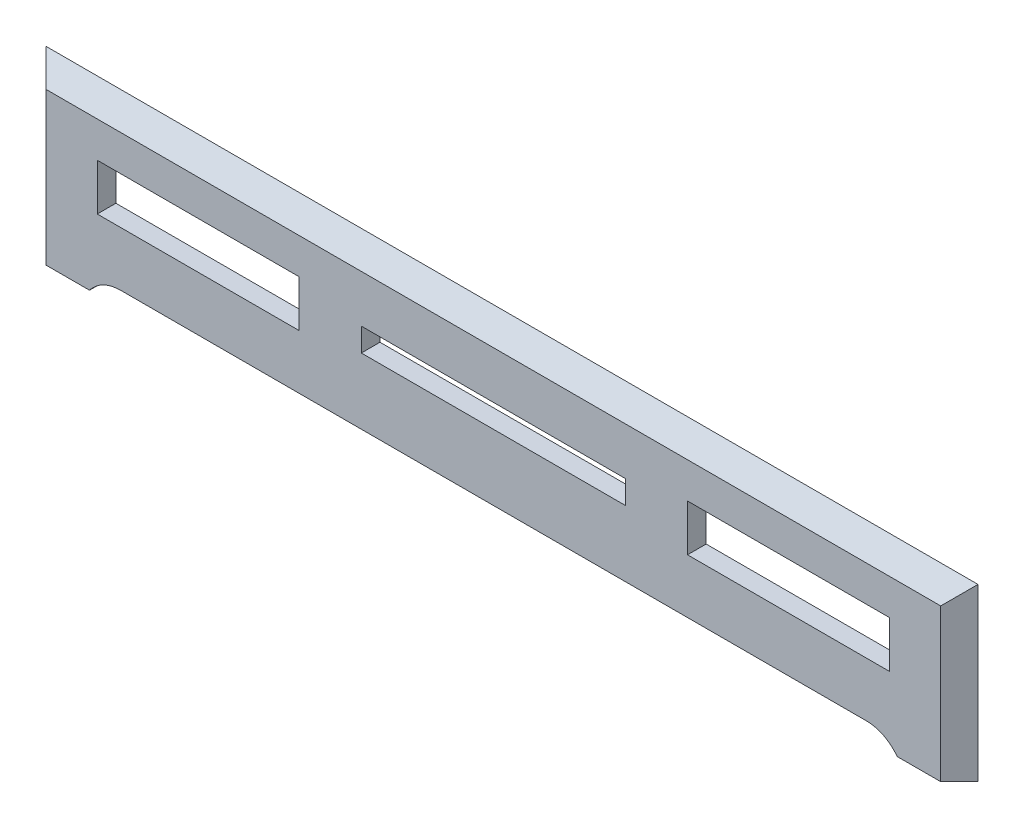
ISO-10303-21;
HEADER;
FILE_DESCRIPTION(('STEP AP214'),'2;1');
FILE_NAME('part.step','',(''),(''),'','','');
FILE_SCHEMA(('AUTOMOTIVE_DESIGN { 1 0 10303 214 1 1 1 1 }'));
ENDSEC;
DATA;
#1=APPLICATION_CONTEXT('core data for automotive mechanical design processes');
#2=APPLICATION_PROTOCOL_DEFINITION('international standard','automotive_design',2000,#1);
#3=PRODUCT_CONTEXT('',#1,'mechanical');
#4=PRODUCT('Part','Part','',(#3));
#5=PRODUCT_RELATED_PRODUCT_CATEGORY('part','',(#4));
#6=PRODUCT_DEFINITION_FORMATION('','',#4);
#7=PRODUCT_DEFINITION_CONTEXT('part definition',#1,'design');
#8=PRODUCT_DEFINITION('design','',#6,#7);
#9=PRODUCT_DEFINITION_SHAPE('','',#8);
#10=(LENGTH_UNIT() NAMED_UNIT(*) SI_UNIT(.MILLI.,.METRE.));
#11=(NAMED_UNIT(*) PLANE_ANGLE_UNIT() SI_UNIT($,.RADIAN.));
#12=(NAMED_UNIT(*) SI_UNIT($,.STERADIAN.) SOLID_ANGLE_UNIT());
#13=UNCERTAINTY_MEASURE_WITH_UNIT(LENGTH_MEASURE(1.E-05),#10,'distance_accuracy_value','');
#14=(GEOMETRIC_REPRESENTATION_CONTEXT(3) GLOBAL_UNCERTAINTY_ASSIGNED_CONTEXT((#13)) GLOBAL_UNIT_ASSIGNED_CONTEXT((#10,
#11,#12)) REPRESENTATION_CONTEXT('',''));
#15=CARTESIAN_POINT('',(0.,0.,0.));
#16=DIRECTION('',(0.,0.,1.));
#17=DIRECTION('',(1.,0.,0.));
#18=AXIS2_PLACEMENT_3D('',#15,#16,#17);
#19=CARTESIAN_POINT('',(0.,-10.,12.));
#20=DIRECTION('',(0.,1.,0.));
#21=DIRECTION('',(-1.,0.,0.));
#22=AXIS2_PLACEMENT_3D('',#19,#20,#21);
#23=PLANE('',#22);
#24=DIRECTION('',(1.,0.,0.));
#25=VECTOR('',#24,1.);
#26=CARTESIAN_POINT('',(0.,-10.,12.));
#27=LINE('',#26,#25);
#28=CARTESIAN_POINT('',(12.0000000000001,-10.,12.));
#29=VERTEX_POINT('',#28);
#30=CARTESIAN_POINT('',(40.,-10.,12.));
#31=VERTEX_POINT('',#30);
#32=EDGE_CURVE('E327',#29,#31,#27,.T.);
#33=ORIENTED_EDGE('',*,*,#32,.F.);
#34=DIRECTION('',(-0.707106781186547,0.,-0.707106781186548));
#35=VECTOR('',#34,1.);
#36=CARTESIAN_POINT('',(12.0000000000001,-10.,12.));
#37=LINE('',#36,#35);
#38=CARTESIAN_POINT('',(0.,-10.,0.));
#39=VERTEX_POINT('',#38);
#40=EDGE_CURVE('E11',#29,#39,#37,.T.);
#41=ORIENTED_EDGE('',*,*,#40,.T.);
#42=DIRECTION('',(1.,0.,0.));
#43=VECTOR('',#42,1.);
#44=CARTESIAN_POINT('',(0.,-10.,0.));
#45=LINE('',#44,#43);
#46=CARTESIAN_POINT('',(40.,-10.,0.));
#47=VERTEX_POINT('',#46);
#48=EDGE_CURVE('E348',#39,#47,#45,.T.);
#49=ORIENTED_EDGE('',*,*,#48,.T.);
#50=DIRECTION('',(0.,0.,-1.));
#51=VECTOR('',#50,1.);
#52=CARTESIAN_POINT('',(40.,-10.,12.));
#53=LINE('',#52,#51);
#54=EDGE_CURVE('E381',#31,#47,#53,.T.);
#55=ORIENTED_EDGE('',*,*,#54,.F.);
#56=EDGE_LOOP('',(#33,#41,#49,#55));
#57=FACE_BOUND('',#56,.T.);
#58=ADVANCED_FACE('F41',(#57),#23,.F.);
#59=CARTESIAN_POINT('',(60.,-25.,12.));
#60=DIRECTION('',(0.,0.,-1.));
#61=DIRECTION('',(-1.,0.,0.));
#62=AXIS2_PLACEMENT_3D('',#59,#60,#61);
#63=CYLINDRICAL_SURFACE('',#62,25.);
#64=CARTESIAN_POINT('',(60.,-25.,0.));
#65=DIRECTION('',(0.,0.,-1.));
#66=DIRECTION('',(-1.,0.,0.));
#67=AXIS2_PLACEMENT_3D('',#64,#65,#66);
#68=CIRCLE('',#67,25.);
#69=CARTESIAN_POINT('',(60.,0.,0.));
#70=VERTEX_POINT('',#69);
#71=EDGE_CURVE('E351',#47,#70,#68,.T.);
#72=ORIENTED_EDGE('',*,*,#71,.T.);
#73=DIRECTION('',(0.,0.,-1.));
#74=VECTOR('',#73,1.);
#75=CARTESIAN_POINT('',(60.,0.,12.));
#76=LINE('',#75,#74);
#77=CARTESIAN_POINT('',(60.,0.,12.));
#78=VERTEX_POINT('',#77);
#79=EDGE_CURVE('E377',#78,#70,#76,.T.);
#80=ORIENTED_EDGE('',*,*,#79,.F.);
#81=CARTESIAN_POINT('',(60.,-25.,12.));
#82=DIRECTION('',(0.,0.,-1.));
#83=DIRECTION('',(-1.,0.,0.));
#84=AXIS2_PLACEMENT_3D('',#81,#82,#83);
#85=CIRCLE('',#84,25.);
#86=EDGE_CURVE('E330',#31,#78,#85,.T.);
#87=ORIENTED_EDGE('',*,*,#86,.F.);
#88=ORIENTED_EDGE('',*,*,#54,.T.);
#89=EDGE_LOOP('',(#72,#80,#87,#88));
#90=FACE_BOUND('',#89,.T.);
#91=ADVANCED_FACE('F411',(#90),#63,.F.);
#92=CARTESIAN_POINT('',(60.,0.,12.));
#93=DIRECTION('',(0.,1.,0.));
#94=DIRECTION('',(0.,0.,1.));
#95=AXIS2_PLACEMENT_3D('',#92,#93,#94);
#96=PLANE('',#95);
#97=DIRECTION('',(1.,0.,0.));
#98=VECTOR('',#97,1.);
#99=CARTESIAN_POINT('',(60.,0.,0.));
#100=LINE('',#99,#98);
#101=CARTESIAN_POINT('',(540.,0.,0.));
#102=VERTEX_POINT('',#101);
#103=EDGE_CURVE('E354',#70,#102,#100,.T.);
#104=ORIENTED_EDGE('',*,*,#103,.T.);
#105=DIRECTION('',(0.,0.,-1.));
#106=VECTOR('',#105,1.);
#107=CARTESIAN_POINT('',(540.,0.,12.));
#108=LINE('',#107,#106);
#109=CARTESIAN_POINT('',(540.,0.,12.));
#110=VERTEX_POINT('',#109);
#111=EDGE_CURVE('E373',#110,#102,#108,.T.);
#112=ORIENTED_EDGE('',*,*,#111,.F.);
#113=DIRECTION('',(1.,0.,0.));
#114=VECTOR('',#113,1.);
#115=CARTESIAN_POINT('',(60.,0.,12.));
#116=LINE('',#115,#114);
#117=EDGE_CURVE('E334',#78,#110,#116,.T.);
#118=ORIENTED_EDGE('',*,*,#117,.F.);
#119=ORIENTED_EDGE('',*,*,#79,.T.);
#120=EDGE_LOOP('',(#104,#112,#118,#119));
#121=FACE_BOUND('',#120,.T.);
#122=ADVANCED_FACE('F417',(#121),#96,.F.);
#123=CARTESIAN_POINT('',(540.,-25.,12.));
#124=DIRECTION('',(0.,0.,-1.));
#125=DIRECTION('',(-1.,0.,0.));
#126=AXIS2_PLACEMENT_3D('',#123,#124,#125);
#127=CYLINDRICAL_SURFACE('',#126,25.);
#128=CARTESIAN_POINT('',(540.,-25.,0.));
#129=DIRECTION('',(0.,0.,-1.));
#130=DIRECTION('',(1.,0.,0.));
#131=AXIS2_PLACEMENT_3D('',#128,#129,#130);
#132=CIRCLE('',#131,25.);
#133=CARTESIAN_POINT('',(560.,-10.,0.));
#134=VERTEX_POINT('',#133);
#135=EDGE_CURVE('E357',#102,#134,#132,.T.);
#136=ORIENTED_EDGE('',*,*,#135,.T.);
#137=DIRECTION('',(0.,0.,-1.));
#138=VECTOR('',#137,1.);
#139=CARTESIAN_POINT('',(560.,-10.,12.));
#140=LINE('',#139,#138);
#141=CARTESIAN_POINT('',(560.,-10.,12.));
#142=VERTEX_POINT('',#141);
#143=EDGE_CURVE('E344',#142,#134,#140,.T.);
#144=ORIENTED_EDGE('',*,*,#143,.F.);
#145=CARTESIAN_POINT('',(540.,-25.,12.));
#146=DIRECTION('',(0.,0.,-1.));
#147=DIRECTION('',(1.,0.,0.));
#148=AXIS2_PLACEMENT_3D('',#145,#146,#147);
#149=CIRCLE('',#148,25.);
#150=EDGE_CURVE('E337',#110,#142,#149,.T.);
#151=ORIENTED_EDGE('',*,*,#150,.F.);
#152=ORIENTED_EDGE('',*,*,#111,.T.);
#153=EDGE_LOOP('',(#136,#144,#151,#152));
#154=FACE_BOUND('',#153,.T.);
#155=ADVANCED_FACE('F421',(#154),#127,.F.);
#156=CARTESIAN_POINT('',(600.,-10.,12.));
#157=DIRECTION('',(0.,1.,0.));
#158=DIRECTION('',(-1.,0.,0.));
#159=AXIS2_PLACEMENT_3D('',#156,#157,#158);
#160=PLANE('',#159);
#161=DIRECTION('',(1.,0.,0.));
#162=VECTOR('',#161,1.);
#163=CARTESIAN_POINT('',(600.,-10.,0.));
#164=LINE('',#163,#162);
#165=CARTESIAN_POINT('',(600.,-10.,0.));
#166=VERTEX_POINT('',#165);
#167=EDGE_CURVE('E360',#134,#166,#164,.T.);
#168=ORIENTED_EDGE('',*,*,#167,.T.);
#169=DIRECTION('',(-0.707106781186548,0.,0.707106781186548));
#170=VECTOR('',#169,1.);
#171=CARTESIAN_POINT('',(588.,-10.,12.));
#172=LINE('',#171,#170);
#173=CARTESIAN_POINT('',(588.,-10.,12.));
#174=VERTEX_POINT('',#173);
#175=EDGE_CURVE('E52',#166,#174,#172,.T.);
#176=ORIENTED_EDGE('',*,*,#175,.T.);
#177=DIRECTION('',(1.,0.,0.));
#178=VECTOR('',#177,1.);
#179=CARTESIAN_POINT('',(600.,-10.,12.));
#180=LINE('',#179,#178);
#181=EDGE_CURVE('E340',#142,#174,#180,.T.);
#182=ORIENTED_EDGE('',*,*,#181,.F.);
#183=ORIENTED_EDGE('',*,*,#143,.T.);
#184=EDGE_LOOP('',(#168,#176,#182,#183));
#185=FACE_BOUND('',#184,.T.);
#186=ADVANCED_FACE('F425',(#185),#160,.F.);
#187=CARTESIAN_POINT('',(540.,-25.,12.));
#188=DIRECTION('',(0.,0.,1.));
#189=DIRECTION('',(1.,0.,0.));
#190=AXIS2_PLACEMENT_3D('',#187,#188,#189);
#191=PLANE('',#190);
#192=DIRECTION('',(0.,-1.,0.));
#193=VECTOR('',#192,1.);
#194=CARTESIAN_POINT('',(45.,65.,12.));
#195=LINE('',#194,#193);
#196=CARTESIAN_POINT('',(45.,65.,12.));
#197=VERTEX_POINT('',#196);
#198=CARTESIAN_POINT('',(45.,35.,12.));
#199=VERTEX_POINT('',#198);
#200=EDGE_CURVE('E190',#197,#199,#195,.T.);
#201=ORIENTED_EDGE('',*,*,#200,.F.);
#202=DIRECTION('',(-1.,0.,0.));
#203=VECTOR('',#202,1.);
#204=CARTESIAN_POINT('',(45.,65.,12.));
#205=LINE('',#204,#203);
#206=CARTESIAN_POINT('',(175.,65.,12.));
#207=VERTEX_POINT('',#206);
#208=EDGE_CURVE('E211',#207,#197,#205,.T.);
#209=ORIENTED_EDGE('',*,*,#208,.F.);
#210=DIRECTION('',(0.,1.,0.));
#211=VECTOR('',#210,1.);
#212=CARTESIAN_POINT('',(175.,65.,12.));
#213=LINE('',#212,#211);
#214=CARTESIAN_POINT('',(175.,35.,12.));
#215=VERTEX_POINT('',#214);
#216=EDGE_CURVE('E215',#215,#207,#213,.T.);
#217=ORIENTED_EDGE('',*,*,#216,.F.);
#218=DIRECTION('',(1.,0.,0.));
#219=VECTOR('',#218,1.);
#220=CARTESIAN_POINT('',(45.,35.,12.));
#221=LINE('',#220,#219);
#222=EDGE_CURVE('E224',#199,#215,#221,.T.);
#223=ORIENTED_EDGE('',*,*,#222,.F.);
#224=EDGE_LOOP('',(#201,#209,#217,#223));
#225=FACE_BOUND('',#224,.T.);
#226=DIRECTION('',(0.,-1.,0.));
#227=VECTOR('',#226,1.);
#228=CARTESIAN_POINT('',(215.,57.5,12.));
#229=LINE('',#228,#227);
#230=CARTESIAN_POINT('',(215.,57.5,12.));
#231=VERTEX_POINT('',#230);
#232=CARTESIAN_POINT('',(215.,42.5,12.));
#233=VERTEX_POINT('',#232);
#234=EDGE_CURVE('E258',#231,#233,#229,.T.);
#235=ORIENTED_EDGE('',*,*,#234,.F.);
#236=DIRECTION('',(-1.,0.,0.));
#237=VECTOR('',#236,1.);
#238=CARTESIAN_POINT('',(215.,57.5,12.));
#239=LINE('',#238,#237);
#240=CARTESIAN_POINT('',(385.,57.5,12.));
#241=VERTEX_POINT('',#240);
#242=EDGE_CURVE('E245',#241,#231,#239,.T.);
#243=ORIENTED_EDGE('',*,*,#242,.F.);
#244=DIRECTION('',(0.,1.,0.));
#245=VECTOR('',#244,1.);
#246=CARTESIAN_POINT('',(385.,57.5,12.));
#247=LINE('',#246,#245);
#248=CARTESIAN_POINT('',(385.,42.5,12.));
#249=VERTEX_POINT('',#248);
#250=EDGE_CURVE('E266',#249,#241,#247,.T.);
#251=ORIENTED_EDGE('',*,*,#250,.F.);
#252=DIRECTION('',(1.,0.,0.));
#253=VECTOR('',#252,1.);
#254=CARTESIAN_POINT('',(215.,42.5,12.));
#255=LINE('',#254,#253);
#256=EDGE_CURVE('E261',#233,#249,#255,.T.);
#257=ORIENTED_EDGE('',*,*,#256,.F.);
#258=EDGE_LOOP('',(#235,#243,#251,#257));
#259=FACE_BOUND('',#258,.T.);
#260=DIRECTION('',(0.,-1.,0.));
#261=VECTOR('',#260,1.);
#262=CARTESIAN_POINT('',(425.,65.,12.));
#263=LINE('',#262,#261);
#264=CARTESIAN_POINT('',(425.,65.,12.));
#265=VERTEX_POINT('',#264);
#266=CARTESIAN_POINT('',(425.,35.,12.));
#267=VERTEX_POINT('',#266);
#268=EDGE_CURVE('E302',#265,#267,#263,.T.);
#269=ORIENTED_EDGE('',*,*,#268,.F.);
#270=DIRECTION('',(-1.,0.,0.));
#271=VECTOR('',#270,1.);
#272=CARTESIAN_POINT('',(425.,65.,12.));
#273=LINE('',#272,#271);
#274=CARTESIAN_POINT('',(555.,65.,12.));
#275=VERTEX_POINT('',#274);
#276=EDGE_CURVE('E289',#275,#265,#273,.T.);
#277=ORIENTED_EDGE('',*,*,#276,.F.);
#278=DIRECTION('',(0.,1.,0.));
#279=VECTOR('',#278,1.);
#280=CARTESIAN_POINT('',(555.,65.,12.));
#281=LINE('',#280,#279);
#282=CARTESIAN_POINT('',(555.,35.,12.));
#283=VERTEX_POINT('',#282);
#284=EDGE_CURVE('E309',#283,#275,#281,.T.);
#285=ORIENTED_EDGE('',*,*,#284,.F.);
#286=DIRECTION('',(1.,0.,0.));
#287=VECTOR('',#286,1.);
#288=CARTESIAN_POINT('',(425.,35.,12.));
#289=LINE('',#288,#287);
#290=EDGE_CURVE('E305',#267,#283,#289,.T.);
#291=ORIENTED_EDGE('',*,*,#290,.F.);
#292=EDGE_LOOP('',(#269,#277,#285,#291));
#293=FACE_BOUND('',#292,.T.);
#294=ORIENTED_EDGE('',*,*,#181,.T.);
#295=DIRECTION('',(0.,1.,0.));
#296=VECTOR('',#295,1.);
#297=CARTESIAN_POINT('',(588.,100.,12.));
#298=LINE('',#297,#296);
#299=CARTESIAN_POINT('',(588.,87.9999999999999,12.));
#300=VERTEX_POINT('',#299);
#301=EDGE_CURVE('E390',#174,#300,#298,.T.);
#302=ORIENTED_EDGE('',*,*,#301,.T.);
#303=DIRECTION('',(-1.,0.,0.));
#304=VECTOR('',#303,1.);
#305=CARTESIAN_POINT('',(0.,87.9999999999999,12.));
#306=LINE('',#305,#304);
#307=CARTESIAN_POINT('',(12.0000000000001,87.9999999999999,12.));
#308=VERTEX_POINT('',#307);
#309=EDGE_CURVE('E67',#300,#308,#306,.T.);
#310=ORIENTED_EDGE('',*,*,#309,.T.);
#311=DIRECTION('',(0.,-1.,0.));
#312=VECTOR('',#311,1.);
#313=CARTESIAN_POINT('',(12.0000000000001,-10.,12.));
#314=LINE('',#313,#312);
#315=EDGE_CURVE('E385',#308,#29,#314,.T.);
#316=ORIENTED_EDGE('',*,*,#315,.T.);
#317=ORIENTED_EDGE('',*,*,#32,.T.);
#318=ORIENTED_EDGE('',*,*,#86,.T.);
#319=ORIENTED_EDGE('',*,*,#117,.T.);
#320=ORIENTED_EDGE('',*,*,#150,.T.);
#321=EDGE_LOOP('',(#294,#302,#310,#316,#317,#318,#319,#320));
#322=FACE_BOUND('',#321,.T.);
#323=ADVANCED_FACE('F403',(#225,#259,#293,#322),#191,.T.);
#324=CARTESIAN_POINT('',(540.,-25.,0.));
#325=DIRECTION('',(0.,0.,1.));
#326=DIRECTION('',(1.,0.,0.));
#327=AXIS2_PLACEMENT_3D('',#324,#325,#326);
#328=PLANE('',#327);
#329=DIRECTION('',(-1.,0.,0.));
#330=VECTOR('',#329,1.);
#331=CARTESIAN_POINT('',(45.,65.,0.));
#332=LINE('',#331,#330);
#333=CARTESIAN_POINT('',(175.,65.,0.));
#334=VERTEX_POINT('',#333);
#335=CARTESIAN_POINT('',(45.,65.,0.));
#336=VERTEX_POINT('',#335);
#337=EDGE_CURVE('E196',#334,#336,#332,.T.);
#338=ORIENTED_EDGE('',*,*,#337,.T.);
#339=DIRECTION('',(0.,-1.,0.));
#340=VECTOR('',#339,1.);
#341=CARTESIAN_POINT('',(45.,65.,0.));
#342=LINE('',#341,#340);
#343=CARTESIAN_POINT('',(45.,35.,0.));
#344=VERTEX_POINT('',#343);
#345=EDGE_CURVE('E187',#336,#344,#342,.T.);
#346=ORIENTED_EDGE('',*,*,#345,.T.);
#347=DIRECTION('',(1.,0.,0.));
#348=VECTOR('',#347,1.);
#349=CARTESIAN_POINT('',(45.,35.,0.));
#350=LINE('',#349,#348);
#351=CARTESIAN_POINT('',(175.,35.,0.));
#352=VERTEX_POINT('',#351);
#353=EDGE_CURVE('E200',#344,#352,#350,.T.);
#354=ORIENTED_EDGE('',*,*,#353,.T.);
#355=DIRECTION('',(0.,1.,0.));
#356=VECTOR('',#355,1.);
#357=CARTESIAN_POINT('',(175.,65.,0.));
#358=LINE('',#357,#356);
#359=EDGE_CURVE('E205',#352,#334,#358,.T.);
#360=ORIENTED_EDGE('',*,*,#359,.T.);
#361=EDGE_LOOP('',(#338,#346,#354,#360));
#362=FACE_BOUND('',#361,.T.);
#363=DIRECTION('',(-1.,0.,0.));
#364=VECTOR('',#363,1.);
#365=CARTESIAN_POINT('',(215.,57.5,0.));
#366=LINE('',#365,#364);
#367=CARTESIAN_POINT('',(385.,57.5,0.));
#368=VERTEX_POINT('',#367);
#369=CARTESIAN_POINT('',(215.,57.5,0.));
#370=VERTEX_POINT('',#369);
#371=EDGE_CURVE('E253',#368,#370,#366,.T.);
#372=ORIENTED_EDGE('',*,*,#371,.T.);
#373=DIRECTION('',(0.,-1.,0.));
#374=VECTOR('',#373,1.);
#375=CARTESIAN_POINT('',(215.,57.5,0.));
#376=LINE('',#375,#374);
#377=CARTESIAN_POINT('',(215.,42.5,0.));
#378=VERTEX_POINT('',#377);
#379=EDGE_CURVE('E240',#370,#378,#376,.T.);
#380=ORIENTED_EDGE('',*,*,#379,.T.);
#381=DIRECTION('',(1.,0.,0.));
#382=VECTOR('',#381,1.);
#383=CARTESIAN_POINT('',(215.,42.5,0.));
#384=LINE('',#383,#382);
#385=CARTESIAN_POINT('',(385.,42.5,0.));
#386=VERTEX_POINT('',#385);
#387=EDGE_CURVE('E244',#378,#386,#384,.T.);
#388=ORIENTED_EDGE('',*,*,#387,.T.);
#389=DIRECTION('',(0.,1.,0.));
#390=VECTOR('',#389,1.);
#391=CARTESIAN_POINT('',(385.,57.5,0.));
#392=LINE('',#391,#390);
#393=EDGE_CURVE('E249',#386,#368,#392,.T.);
#394=ORIENTED_EDGE('',*,*,#393,.T.);
#395=EDGE_LOOP('',(#372,#380,#388,#394));
#396=FACE_BOUND('',#395,.T.);
#397=DIRECTION('',(-1.,0.,0.));
#398=VECTOR('',#397,1.);
#399=CARTESIAN_POINT('',(425.,65.,0.));
#400=LINE('',#399,#398);
#401=CARTESIAN_POINT('',(555.,65.,0.));
#402=VERTEX_POINT('',#401);
#403=CARTESIAN_POINT('',(425.,65.,0.));
#404=VERTEX_POINT('',#403);
#405=EDGE_CURVE('E297',#402,#404,#400,.T.);
#406=ORIENTED_EDGE('',*,*,#405,.T.);
#407=DIRECTION('',(0.,-1.,0.));
#408=VECTOR('',#407,1.);
#409=CARTESIAN_POINT('',(425.,65.,0.));
#410=LINE('',#409,#408);
#411=CARTESIAN_POINT('',(425.,35.,0.));
#412=VERTEX_POINT('',#411);
#413=EDGE_CURVE('E284',#404,#412,#410,.T.);
#414=ORIENTED_EDGE('',*,*,#413,.T.);
#415=DIRECTION('',(1.,0.,0.));
#416=VECTOR('',#415,1.);
#417=CARTESIAN_POINT('',(425.,35.,0.));
#418=LINE('',#417,#416);
#419=CARTESIAN_POINT('',(555.,35.,0.));
#420=VERTEX_POINT('',#419);
#421=EDGE_CURVE('E288',#412,#420,#418,.T.);
#422=ORIENTED_EDGE('',*,*,#421,.T.);
#423=DIRECTION('',(0.,1.,0.));
#424=VECTOR('',#423,1.);
#425=CARTESIAN_POINT('',(555.,65.,0.));
#426=LINE('',#425,#424);
#427=EDGE_CURVE('E293',#420,#402,#426,.T.);
#428=ORIENTED_EDGE('',*,*,#427,.T.);
#429=EDGE_LOOP('',(#406,#414,#422,#428));
#430=FACE_BOUND('',#429,.T.);
#431=DIRECTION('',(0.,-1.,0.));
#432=VECTOR('',#431,1.);
#433=CARTESIAN_POINT('',(0.,0.,0.));
#434=LINE('',#433,#432);
#435=CARTESIAN_POINT('',(0.,100.,0.));
#436=VERTEX_POINT('',#435);
#437=EDGE_CURVE('E234',#436,#39,#434,.T.);
#438=ORIENTED_EDGE('',*,*,#437,.F.);
#439=DIRECTION('',(-1.,0.,0.));
#440=VECTOR('',#439,1.);
#441=CARTESIAN_POINT('',(0.,100.,0.));
#442=LINE('',#441,#440);
#443=CARTESIAN_POINT('',(600.,100.,0.));
#444=VERTEX_POINT('',#443);
#445=EDGE_CURVE('E331',#444,#436,#442,.T.);
#446=ORIENTED_EDGE('',*,*,#445,.F.);
#447=DIRECTION('',(0.,1.,0.));
#448=VECTOR('',#447,1.);
#449=CARTESIAN_POINT('',(600.,0.,0.));
#450=LINE('',#449,#448);
#451=EDGE_CURVE('E364',#166,#444,#450,.T.);
#452=ORIENTED_EDGE('',*,*,#451,.F.);
#453=ORIENTED_EDGE('',*,*,#167,.F.);
#454=ORIENTED_EDGE('',*,*,#135,.F.);
#455=ORIENTED_EDGE('',*,*,#103,.F.);
#456=ORIENTED_EDGE('',*,*,#71,.F.);
#457=ORIENTED_EDGE('',*,*,#48,.F.);
#458=EDGE_LOOP('',(#438,#446,#452,#453,#454,#455,#456,#457));
#459=FACE_BOUND('',#458,.T.);
#460=ADVANCED_FACE('F207',(#362,#396,#430,#459),#328,.F.);
#461=CARTESIAN_POINT('',(425.,65.,0.));
#462=DIRECTION('',(-1.,0.,0.));
#463=DIRECTION('',(0.,0.,1.));
#464=AXIS2_PLACEMENT_3D('',#461,#462,#463);
#465=PLANE('',#464);
#466=ORIENTED_EDGE('',*,*,#268,.T.);
#467=DIRECTION('',(0.,0.,1.));
#468=VECTOR('',#467,1.);
#469=CARTESIAN_POINT('',(425.,35.,0.));
#470=LINE('',#469,#468);
#471=EDGE_CURVE('E301',#412,#267,#470,.T.);
#472=ORIENTED_EDGE('',*,*,#471,.F.);
#473=ORIENTED_EDGE('',*,*,#413,.F.);
#474=DIRECTION('',(0.,0.,1.));
#475=VECTOR('',#474,1.);
#476=CARTESIAN_POINT('',(425.,65.,0.));
#477=LINE('',#476,#475);
#478=EDGE_CURVE('E262',#404,#265,#477,.T.);
#479=ORIENTED_EDGE('',*,*,#478,.T.);
#480=EDGE_LOOP('',(#466,#472,#473,#479));
#481=FACE_BOUND('',#480,.T.);
#482=ADVANCED_FACE('F430',(#481),#465,.F.);
#483=CARTESIAN_POINT('',(425.,65.,0.));
#484=DIRECTION('',(0.,1.,0.));
#485=DIRECTION('',(0.,0.,1.));
#486=AXIS2_PLACEMENT_3D('',#483,#484,#485);
#487=PLANE('',#486);
#488=ORIENTED_EDGE('',*,*,#276,.T.);
#489=ORIENTED_EDGE('',*,*,#478,.F.);
#490=ORIENTED_EDGE('',*,*,#405,.F.);
#491=DIRECTION('',(0.,0.,1.));
#492=VECTOR('',#491,1.);
#493=CARTESIAN_POINT('',(555.,65.,0.));
#494=LINE('',#493,#492);
#495=EDGE_CURVE('E318',#402,#275,#494,.T.);
#496=ORIENTED_EDGE('',*,*,#495,.T.);
#497=EDGE_LOOP('',(#488,#489,#490,#496));
#498=FACE_BOUND('',#497,.T.);
#499=ADVANCED_FACE('F436',(#498),#487,.F.);
#500=CARTESIAN_POINT('',(555.,65.,0.));
#501=DIRECTION('',(1.,0.,0.));
#502=DIRECTION('',(0.,0.,-1.));
#503=AXIS2_PLACEMENT_3D('',#500,#501,#502);
#504=PLANE('',#503);
#505=ORIENTED_EDGE('',*,*,#284,.T.);
#506=ORIENTED_EDGE('',*,*,#495,.F.);
#507=ORIENTED_EDGE('',*,*,#427,.F.);
#508=DIRECTION('',(0.,0.,1.));
#509=VECTOR('',#508,1.);
#510=CARTESIAN_POINT('',(555.,35.,0.));
#511=LINE('',#510,#509);
#512=EDGE_CURVE('E321',#420,#283,#511,.T.);
#513=ORIENTED_EDGE('',*,*,#512,.T.);
#514=EDGE_LOOP('',(#505,#506,#507,#513));
#515=FACE_BOUND('',#514,.T.);
#516=ADVANCED_FACE('F495',(#515),#504,.F.);
#517=CARTESIAN_POINT('',(425.,35.,0.));
#518=DIRECTION('',(0.,-1.,0.));
#519=DIRECTION('',(0.,0.,-1.));
#520=AXIS2_PLACEMENT_3D('',#517,#518,#519);
#521=PLANE('',#520);
#522=ORIENTED_EDGE('',*,*,#290,.T.);
#523=ORIENTED_EDGE('',*,*,#512,.F.);
#524=ORIENTED_EDGE('',*,*,#421,.F.);
#525=ORIENTED_EDGE('',*,*,#471,.T.);
#526=EDGE_LOOP('',(#522,#523,#524,#525));
#527=FACE_BOUND('',#526,.T.);
#528=ADVANCED_FACE('F491',(#527),#521,.F.);
#529=CARTESIAN_POINT('',(215.,57.5,0.));
#530=DIRECTION('',(-1.,0.,0.));
#531=DIRECTION('',(0.,0.,1.));
#532=AXIS2_PLACEMENT_3D('',#529,#530,#531);
#533=PLANE('',#532);
#534=ORIENTED_EDGE('',*,*,#234,.T.);
#535=DIRECTION('',(0.,0.,1.));
#536=VECTOR('',#535,1.);
#537=CARTESIAN_POINT('',(215.,42.5,0.));
#538=LINE('',#537,#536);
#539=EDGE_CURVE('E257',#378,#233,#538,.T.);
#540=ORIENTED_EDGE('',*,*,#539,.F.);
#541=ORIENTED_EDGE('',*,*,#379,.F.);
#542=DIRECTION('',(0.,0.,1.));
#543=VECTOR('',#542,1.);
#544=CARTESIAN_POINT('',(215.,57.5,0.));
#545=LINE('',#544,#543);
#546=EDGE_CURVE('E225',#370,#231,#545,.T.);
#547=ORIENTED_EDGE('',*,*,#546,.T.);
#548=EDGE_LOOP('',(#534,#540,#541,#547));
#549=FACE_BOUND('',#548,.T.);
#550=ADVANCED_FACE('F481',(#549),#533,.F.);
#551=CARTESIAN_POINT('',(215.,57.5,0.));
#552=DIRECTION('',(0.,1.,0.));
#553=DIRECTION('',(-1.,0.,0.));
#554=AXIS2_PLACEMENT_3D('',#551,#552,#553);
#555=PLANE('',#554);
#556=ORIENTED_EDGE('',*,*,#242,.T.);
#557=ORIENTED_EDGE('',*,*,#546,.F.);
#558=ORIENTED_EDGE('',*,*,#371,.F.);
#559=DIRECTION('',(0.,0.,1.));
#560=VECTOR('',#559,1.);
#561=CARTESIAN_POINT('',(385.,57.5,0.));
#562=LINE('',#561,#560);
#563=EDGE_CURVE('E275',#368,#241,#562,.T.);
#564=ORIENTED_EDGE('',*,*,#563,.T.);
#565=EDGE_LOOP('',(#556,#557,#558,#564));
#566=FACE_BOUND('',#565,.T.);
#567=ADVANCED_FACE('F477',(#566),#555,.F.);
#568=CARTESIAN_POINT('',(385.,57.5,0.));
#569=DIRECTION('',(1.,0.,0.));
#570=DIRECTION('',(0.,0.,-1.));
#571=AXIS2_PLACEMENT_3D('',#568,#569,#570);
#572=PLANE('',#571);
#573=ORIENTED_EDGE('',*,*,#250,.T.);
#574=ORIENTED_EDGE('',*,*,#563,.F.);
#575=ORIENTED_EDGE('',*,*,#393,.F.);
#576=DIRECTION('',(0.,0.,1.));
#577=VECTOR('',#576,1.);
#578=CARTESIAN_POINT('',(385.,42.5,0.));
#579=LINE('',#578,#577);
#580=EDGE_CURVE('E278',#386,#249,#579,.T.);
#581=ORIENTED_EDGE('',*,*,#580,.T.);
#582=EDGE_LOOP('',(#573,#574,#575,#581));
#583=FACE_BOUND('',#582,.T.);
#584=ADVANCED_FACE('F480',(#583),#572,.F.);
#585=CARTESIAN_POINT('',(215.,42.5,0.));
#586=DIRECTION('',(0.,-1.,0.));
#587=DIRECTION('',(1.,0.,0.));
#588=AXIS2_PLACEMENT_3D('',#585,#586,#587);
#589=PLANE('',#588);
#590=ORIENTED_EDGE('',*,*,#256,.T.);
#591=ORIENTED_EDGE('',*,*,#580,.F.);
#592=ORIENTED_EDGE('',*,*,#387,.F.);
#593=ORIENTED_EDGE('',*,*,#539,.T.);
#594=EDGE_LOOP('',(#590,#591,#592,#593));
#595=FACE_BOUND('',#594,.T.);
#596=ADVANCED_FACE('F476',(#595),#589,.F.);
#597=CARTESIAN_POINT('',(45.,65.,0.));
#598=DIRECTION('',(-1.,0.,0.));
#599=DIRECTION('',(0.,0.,1.));
#600=AXIS2_PLACEMENT_3D('',#597,#598,#599);
#601=PLANE('',#600);
#602=ORIENTED_EDGE('',*,*,#200,.T.);
#603=DIRECTION('',(0.,0.,1.));
#604=VECTOR('',#603,1.);
#605=CARTESIAN_POINT('',(45.,35.,0.));
#606=LINE('',#605,#604);
#607=EDGE_CURVE('E183',#344,#199,#606,.T.);
#608=ORIENTED_EDGE('',*,*,#607,.F.);
#609=ORIENTED_EDGE('',*,*,#345,.F.);
#610=DIRECTION('',(0.,0.,1.));
#611=VECTOR('',#610,1.);
#612=CARTESIAN_POINT('',(45.,65.,0.));
#613=LINE('',#612,#611);
#614=EDGE_CURVE('E231',#336,#197,#613,.T.);
#615=ORIENTED_EDGE('',*,*,#614,.T.);
#616=EDGE_LOOP('',(#602,#608,#609,#615));
#617=FACE_BOUND('',#616,.T.);
#618=ADVANCED_FACE('F185',(#617),#601,.F.);
#619=CARTESIAN_POINT('',(45.,65.,0.));
#620=DIRECTION('',(0.,1.,0.));
#621=DIRECTION('',(-1.,0.,0.));
#622=AXIS2_PLACEMENT_3D('',#619,#620,#621);
#623=PLANE('',#622);
#624=ORIENTED_EDGE('',*,*,#208,.T.);
#625=ORIENTED_EDGE('',*,*,#614,.F.);
#626=ORIENTED_EDGE('',*,*,#337,.F.);
#627=DIRECTION('',(0.,0.,1.));
#628=VECTOR('',#627,1.);
#629=CARTESIAN_POINT('',(175.,65.,0.));
#630=LINE('',#629,#628);
#631=EDGE_CURVE('E235',#334,#207,#630,.T.);
#632=ORIENTED_EDGE('',*,*,#631,.T.);
#633=EDGE_LOOP('',(#624,#625,#626,#632));
#634=FACE_BOUND('',#633,.T.);
#635=ADVANCED_FACE('F469',(#634),#623,.F.);
#636=CARTESIAN_POINT('',(175.,65.,0.));
#637=DIRECTION('',(1.,0.,0.));
#638=DIRECTION('',(0.,0.,-1.));
#639=AXIS2_PLACEMENT_3D('',#636,#637,#638);
#640=PLANE('',#639);
#641=ORIENTED_EDGE('',*,*,#216,.T.);
#642=ORIENTED_EDGE('',*,*,#631,.F.);
#643=ORIENTED_EDGE('',*,*,#359,.F.);
#644=DIRECTION('',(0.,0.,1.));
#645=VECTOR('',#644,1.);
#646=CARTESIAN_POINT('',(175.,35.,0.));
#647=LINE('',#646,#645);
#648=EDGE_CURVE('E195',#352,#215,#647,.T.);
#649=ORIENTED_EDGE('',*,*,#648,.T.);
#650=EDGE_LOOP('',(#641,#642,#643,#649));
#651=FACE_BOUND('',#650,.T.);
#652=ADVANCED_FACE('F464',(#651),#640,.F.);
#653=CARTESIAN_POINT('',(45.,35.,0.));
#654=DIRECTION('',(0.,-1.,0.));
#655=DIRECTION('',(1.,0.,0.));
#656=AXIS2_PLACEMENT_3D('',#653,#654,#655);
#657=PLANE('',#656);
#658=ORIENTED_EDGE('',*,*,#222,.T.);
#659=ORIENTED_EDGE('',*,*,#648,.F.);
#660=ORIENTED_EDGE('',*,*,#353,.F.);
#661=ORIENTED_EDGE('',*,*,#607,.T.);
#662=EDGE_LOOP('',(#658,#659,#660,#661));
#663=FACE_BOUND('',#662,.T.);
#664=ADVANCED_FACE('F201',(#663),#657,.F.);
#665=CARTESIAN_POINT('',(12.0000000000001,-25.0000000000001,12.));
#666=DIRECTION('',(-0.707106781186547,0.,0.707106781186547));
#667=DIRECTION('',(0.,1.,0.));
#668=AXIS2_PLACEMENT_3D('',#665,#666,#667);
#669=PLANE('',#668);
#670=ORIENTED_EDGE('',*,*,#40,.F.);
#671=ORIENTED_EDGE('',*,*,#315,.F.);
#672=DIRECTION('',(-0.577350269189626,0.577350269189626,-0.577350269189626));
#673=VECTOR('',#672,1.);
#674=CARTESIAN_POINT('',(49.6666666666668,50.3333333333332,49.6666666666667));
#675=LINE('',#674,#673);
#676=EDGE_CURVE('E46',#436,#308,#675,.F.);
#677=ORIENTED_EDGE('',*,*,#676,.F.);
#678=ORIENTED_EDGE('',*,*,#437,.T.);
#679=EDGE_LOOP('',(#670,#671,#677,#678));
#680=FACE_BOUND('',#679,.T.);
#681=ADVANCED_FACE('F44',(#680),#669,.T.);
#682=CARTESIAN_POINT('',(540.,87.9999999999999,12.));
#683=DIRECTION('',(0.,0.707106781186547,0.707106781186547));
#684=DIRECTION('',(1.,0.,0.));
#685=AXIS2_PLACEMENT_3D('',#682,#683,#684);
#686=PLANE('',#685);
#687=ORIENTED_EDGE('',*,*,#676,.T.);
#688=ORIENTED_EDGE('',*,*,#309,.F.);
#689=DIRECTION('',(0.577350269189626,0.577350269189626,-0.577350269189626));
#690=VECTOR('',#689,1.);
#691=CARTESIAN_POINT('',(572.,71.9999999999999,28.));
#692=LINE('',#691,#690);
#693=EDGE_CURVE('E60',#444,#300,#692,.F.);
#694=ORIENTED_EDGE('',*,*,#693,.F.);
#695=ORIENTED_EDGE('',*,*,#445,.T.);
#696=EDGE_LOOP('',(#687,#688,#694,#695));
#697=FACE_BOUND('',#696,.T.);
#698=ADVANCED_FACE('F399',(#697),#686,.T.);
#699=CARTESIAN_POINT('',(588.,-25.,12.));
#700=DIRECTION('',(0.707106781186547,0.,0.707106781186547));
#701=DIRECTION('',(0.,-1.,0.));
#702=AXIS2_PLACEMENT_3D('',#699,#700,#701);
#703=PLANE('',#702);
#704=ORIENTED_EDGE('',*,*,#175,.F.);
#705=ORIENTED_EDGE('',*,*,#451,.T.);
#706=ORIENTED_EDGE('',*,*,#693,.T.);
#707=ORIENTED_EDGE('',*,*,#301,.F.);
#708=EDGE_LOOP('',(#704,#705,#706,#707));
#709=FACE_BOUND('',#708,.T.);
#710=ADVANCED_FACE('F427',(#709),#703,.T.);
#711=CLOSED_SHELL('',(#58,#91,#122,#155,#186,#323,#460,#482,#499,#516,#528,#550,#567,#584,#596,
#618,#635,#652,#664,#681,#698,#710));
#712=MANIFOLD_SOLID_BREP('B2',#711);
#713=ADVANCED_BREP_SHAPE_REPRESENTATION('',(#18,#712),#14);
#714=SHAPE_DEFINITION_REPRESENTATION(#9,#713);
ENDSEC;
END-ISO-10303-21;
